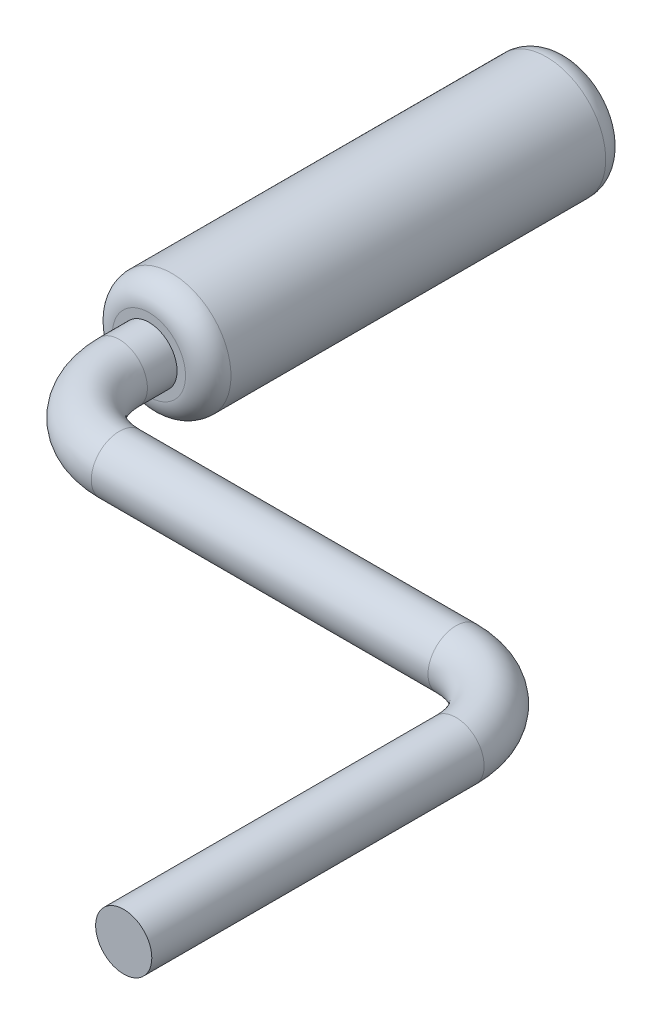
ISO-10303-21;
HEADER;
FILE_DESCRIPTION(('STEP AP214'),'2;1');
FILE_NAME('part.step','',(''),(''),'','','');
FILE_SCHEMA(('AUTOMOTIVE_DESIGN { 1 0 10303 214 1 1 1 1 }'));
ENDSEC;
DATA;
#1=APPLICATION_CONTEXT('core data for automotive mechanical design processes');
#2=APPLICATION_PROTOCOL_DEFINITION('international standard','automotive_design',2000,#1);
#3=PRODUCT_CONTEXT('',#1,'mechanical');
#4=PRODUCT('Part','Part','',(#3));
#5=PRODUCT_RELATED_PRODUCT_CATEGORY('part','',(#4));
#6=PRODUCT_DEFINITION_FORMATION('','',#4);
#7=PRODUCT_DEFINITION_CONTEXT('part definition',#1,'design');
#8=PRODUCT_DEFINITION('design','',#6,#7);
#9=PRODUCT_DEFINITION_SHAPE('','',#8);
#10=(LENGTH_UNIT() NAMED_UNIT(*) SI_UNIT(.MILLI.,.METRE.));
#11=(NAMED_UNIT(*) PLANE_ANGLE_UNIT() SI_UNIT($,.RADIAN.));
#12=(NAMED_UNIT(*) SI_UNIT($,.STERADIAN.) SOLID_ANGLE_UNIT());
#13=UNCERTAINTY_MEASURE_WITH_UNIT(LENGTH_MEASURE(1.E-05),#10,'distance_accuracy_value','');
#14=(GEOMETRIC_REPRESENTATION_CONTEXT(3) GLOBAL_UNCERTAINTY_ASSIGNED_CONTEXT((#13)) GLOBAL_UNIT_ASSIGNED_CONTEXT((#10,
#11,#12)) REPRESENTATION_CONTEXT('',''));
#15=CARTESIAN_POINT('',(0.,0.,0.));
#16=DIRECTION('',(0.,0.,1.));
#17=DIRECTION('',(1.,0.,0.));
#18=AXIS2_PLACEMENT_3D('',#15,#16,#17);
#19=CARTESIAN_POINT('',(-212.73897429128,710.985218525533,-896.762210018078));
#20=DIRECTION('',(0.,0.,-1.));
#21=DIRECTION('',(-1.,0.,0.));
#22=AXIS2_PLACEMENT_3D('',#19,#20,#21);
#23=CYLINDRICAL_SURFACE('',#22,6.28165067377778);
#24=CARTESIAN_POINT('',(-212.73897429128,710.985218525533,-896.762210018078));
#25=DIRECTION('',(0.,0.,-1.));
#26=DIRECTION('',(-1.,0.,0.));
#27=AXIS2_PLACEMENT_3D('',#24,#25,#26);
#28=CIRCLE('',#27,6.28165067377778);
#29=CARTESIAN_POINT('',(-219.020624965058,710.985218525533,-896.762210018078));
#30=VERTEX_POINT('',#29);
#31=EDGE_CURVE('E57',#30,#30,#28,.T.);
#32=ORIENTED_EDGE('',*,*,#31,.T.);
#33=EDGE_LOOP('',(#32));
#34=FACE_BOUND('',#33,.T.);
#35=CARTESIAN_POINT('',(-212.73897429128,710.985218525533,-903.396214376402));
#36=DIRECTION('',(0.,0.,-1.));
#37=DIRECTION('',(-1.,0.,0.));
#38=AXIS2_PLACEMENT_3D('',#35,#36,#37);
#39=CIRCLE('',#38,6.28165067377778);
#40=CARTESIAN_POINT('',(-219.020624965058,710.985218525533,-903.396214376402));
#41=VERTEX_POINT('',#40);
#42=EDGE_CURVE('E54',#41,#41,#39,.F.);
#43=ORIENTED_EDGE('',*,*,#42,.T.);
#44=EDGE_LOOP('',(#43));
#45=FACE_BOUND('',#44,.T.);
#46=ADVANCED_FACE('F33',(#34,#45),#23,.T.);
#47=CARTESIAN_POINT('',(-101.863707381302,710.985218525533,-861.202210018078));
#48=DIRECTION('',(0.,0.,1.));
#49=DIRECTION('',(1.,0.,0.));
#50=AXIS2_PLACEMENT_3D('',#47,#48,#49);
#51=CYLINDRICAL_SURFACE('',#50,6.28165067377778);
#52=CARTESIAN_POINT('',(-101.863707381302,710.985218525533,-861.202210018078));
#53=DIRECTION('',(0.,0.,-1.));
#54=DIRECTION('',(-1.,0.,0.));
#55=AXIS2_PLACEMENT_3D('',#52,#53,#54);
#56=CIRCLE('',#55,6.28165067377778);
#57=CARTESIAN_POINT('',(-95.5820567075241,710.985218525533,-861.202210018078));
#58=VERTEX_POINT('',#57);
#59=EDGE_CURVE('E60',#58,#58,#56,.T.);
#60=CARTESIAN_POINT('',(-101.863707381302,710.985218525533,-786.864459981202));
#61=DIRECTION('',(0.,0.,-1.));
#62=DIRECTION('',(-1.,0.,0.));
#63=AXIS2_PLACEMENT_3D('',#60,#61,#62);
#64=CIRCLE('',#63,6.28165067377778);
#65=CARTESIAN_POINT('',(-95.5820567075241,710.985218525533,-786.864459981202));
#66=VERTEX_POINT('',#65);
#67=EDGE_CURVE('E53',#66,#66,#64,.T.);
#68=CARTESIAN_POINT('',(-95.5820567075241,710.985218525533,-861.202210018078));
#69=CARTESIAN_POINT('',(-95.5820567075241,710.985218525533,-860.427858455194));
#70=CARTESIAN_POINT('',(-95.5820567075241,710.985218525533,-859.65350689231));
#71=CARTESIAN_POINT('',(-95.5820567075241,710.985218525533,-858.104803766541));
#72=CARTESIAN_POINT('',(-95.5820567075241,710.985218525533,-857.330452203657));
#73=CARTESIAN_POINT('',(-95.5820567075241,710.985218525533,-855.781749077889));
#74=CARTESIAN_POINT('',(-95.5820567075241,710.985218525533,-855.007397515005));
#75=CARTESIAN_POINT('',(-95.5820567075241,710.985218525533,-853.458694389236));
#76=CARTESIAN_POINT('',(-95.5820567075241,710.985218525533,-852.684342826352));
#77=CARTESIAN_POINT('',(-95.5820567075241,710.985218525533,-851.135639700584));
#78=CARTESIAN_POINT('',(-95.5820567075241,710.985218525533,-850.3612881377));
#79=CARTESIAN_POINT('',(-95.5820567075241,710.985218525533,-848.812585011932));
#80=CARTESIAN_POINT('',(-95.5820567075241,710.985218525533,-848.038233449048));
#81=CARTESIAN_POINT('',(-95.5820567075241,710.985218525533,-846.489530323279));
#82=CARTESIAN_POINT('',(-95.5820567075241,710.985218525533,-845.715178760395));
#83=CARTESIAN_POINT('',(-95.5820567075241,710.985218525533,-844.166475634627));
#84=CARTESIAN_POINT('',(-95.5820567075241,710.985218525533,-843.392124071743));
#85=CARTESIAN_POINT('',(-95.5820567075241,710.985218525533,-841.843420945975));
#86=CARTESIAN_POINT('',(-95.5820567075241,710.985218525533,-841.06906938309));
#87=CARTESIAN_POINT('',(-95.5820567075241,710.985218525533,-839.520366257322));
#88=CARTESIAN_POINT('',(-95.5820567075241,710.985218525533,-838.746014694438));
#89=CARTESIAN_POINT('',(-95.5820567075241,710.985218525533,-837.19731156867));
#90=CARTESIAN_POINT('',(-95.5820567075241,710.985218525533,-836.422960005786));
#91=CARTESIAN_POINT('',(-95.5820567075241,710.985218525533,-834.874256880017));
#92=CARTESIAN_POINT('',(-95.5820567075241,710.985218525533,-834.099905317133));
#93=CARTESIAN_POINT('',(-95.5820567075241,710.985218525533,-832.551202191365));
#94=CARTESIAN_POINT('',(-95.5820567075241,710.985218525533,-831.776850628481));
#95=CARTESIAN_POINT('',(-95.5820567075241,710.985218525533,-830.228147502713));
#96=CARTESIAN_POINT('',(-95.5820567075241,710.985218525533,-829.453795939829));
#97=CARTESIAN_POINT('',(-95.5820567075241,710.985218525533,-827.90509281406));
#98=CARTESIAN_POINT('',(-95.5820567075241,710.985218525533,-827.130741251176));
#99=CARTESIAN_POINT('',(-95.5820567075241,710.985218525533,-825.582038125408));
#100=CARTESIAN_POINT('',(-95.5820567075241,710.985218525533,-824.807686562524));
#101=CARTESIAN_POINT('',(-95.5820567075241,710.985218525533,-823.258983436756));
#102=CARTESIAN_POINT('',(-95.5820567075241,710.985218525533,-822.484631873871));
#103=CARTESIAN_POINT('',(-95.5820567075241,710.985218525533,-820.935928748103));
#104=CARTESIAN_POINT('',(-95.5820567075241,710.985218525533,-820.161577185219));
#105=CARTESIAN_POINT('',(-95.5820567075241,710.985218525533,-818.612874059451));
#106=CARTESIAN_POINT('',(-95.5820567075241,710.985218525533,-817.838522496567));
#107=CARTESIAN_POINT('',(-95.5820567075241,710.985218525533,-816.289819370798));
#108=CARTESIAN_POINT('',(-95.5820567075241,710.985218525533,-815.515467807914));
#109=CARTESIAN_POINT('',(-95.5820567075241,710.985218525533,-813.966764682146));
#110=CARTESIAN_POINT('',(-95.5820567075241,710.985218525533,-813.192413119262));
#111=CARTESIAN_POINT('',(-95.5820567075241,710.985218525533,-811.643709993494));
#112=CARTESIAN_POINT('',(-95.5820567075241,710.985218525533,-810.86935843061));
#113=CARTESIAN_POINT('',(-95.5820567075241,710.985218525533,-809.320655304841));
#114=CARTESIAN_POINT('',(-95.5820567075241,710.985218525533,-808.546303741957));
#115=CARTESIAN_POINT('',(-95.5820567075241,710.985218525533,-806.997600616189));
#116=CARTESIAN_POINT('',(-95.5820567075241,710.985218525533,-806.223249053305));
#117=CARTESIAN_POINT('',(-95.5820567075241,710.985218525533,-804.674545927537));
#118=CARTESIAN_POINT('',(-95.5820567075241,710.985218525533,-803.900194364652));
#119=CARTESIAN_POINT('',(-95.5820567075241,710.985218525533,-802.351491238884));
#120=CARTESIAN_POINT('',(-95.5820567075241,710.985218525533,-801.577139676));
#121=CARTESIAN_POINT('',(-95.5820567075241,710.985218525533,-800.028436550232));
#122=CARTESIAN_POINT('',(-95.5820567075241,710.985218525533,-799.254084987348));
#123=CARTESIAN_POINT('',(-95.5820567075241,710.985218525533,-797.705381861579));
#124=CARTESIAN_POINT('',(-95.5820567075241,710.985218525533,-796.931030298695));
#125=CARTESIAN_POINT('',(-95.5820567075241,710.985218525533,-795.382327172927));
#126=CARTESIAN_POINT('',(-95.5820567075241,710.985218525533,-794.607975610043));
#127=CARTESIAN_POINT('',(-95.5820567075241,710.985218525533,-793.059272484275));
#128=CARTESIAN_POINT('',(-95.5820567075241,710.985218525533,-792.284920921391));
#129=CARTESIAN_POINT('',(-95.5820567075241,710.985218525533,-790.736217795622));
#130=CARTESIAN_POINT('',(-95.5820567075241,710.985218525533,-789.961866232738));
#131=CARTESIAN_POINT('',(-95.5820567075241,710.985218525533,-788.41316310697));
#132=CARTESIAN_POINT('',(-95.5820567075241,710.985218525533,-787.638811544086));
#133=CARTESIAN_POINT('',(-95.5820567075241,710.985218525533,-786.864459981202));
#134=B_SPLINE_CURVE_WITH_KNOTS('',3,(#68,#69,#70,#71,#72,#73,#74,#75,#76,#77,#78,#79,#80,#81,
#82,#83,#84,#85,#86,#87,#88,#89,#90,#91,#92,#93,#94,#95,#96,#97,#98,#99,#100,#101,#102,#103,
#104,#105,#106,#107,#108,#109,#110,#111,#112,#113,#114,#115,#116,#117,#118,#119,#120,#121,#122,
#123,#124,#125,#126,#127,#128,#129,#130,#131,#132,#133),.UNSPECIFIED.,.F.,.F.,(4,2,2,2,2,2,2,2,
2,2,2,2,2,2,2,2,2,2,2,2,2,2,2,2,2,2,2,2,2,2,2,2,4),(0.,2.32305468865246,4.64610937730481,
6.96916406595716,9.29221875460962,11.615273443262,13.9383281319143,16.2613828205667,
18.5844375092191,20.9074921978715,23.2305468865238,25.5536015751762,27.8766562638286,
30.199710952481,32.5227656411333,34.8458203297857,37.1688750184381,39.4919297070905,
41.8149843957428,44.1380390843952,46.4610937730476,48.7841484617,51.1072031503523,
53.4302578390047,55.7533125276571,58.0763672163095,60.3994219049618,62.7224765936142,
65.0455312822666,67.368585970919,69.6916406595713,72.0146953482237,74.3377500368761),.UNSPECIFIED.);
#135=EDGE_CURVE('BSEAM90',#58,#66,#134,.T.);
#136=ORIENTED_EDGE('',*,*,#59,.F.);
#137=ORIENTED_EDGE('',*,*,#67,.T.);
#138=ORIENTED_EDGE('',*,*,#135,.T.);
#139=ORIENTED_EDGE('',*,*,#135,.F.);
#140=EDGE_LOOP('',(#136,#138,#137,#139));
#141=FACE_BOUND('',#140,.T.);
#142=ADVANCED_FACE('F90',(#141),#51,.T.);
#143=CARTESIAN_POINT('',(-119.643707381302,710.985218525533,-861.202210018078));
#144=DIRECTION('',(0.,-1.,0.));
#145=DIRECTION('',(0.,0.,-1.));
#146=AXIS2_PLACEMENT_3D('',#143,#144,#145);
#147=TOROIDAL_SURFACE('',#146,17.78,6.28165067377778);
#148=CARTESIAN_POINT('',(-119.643707381302,710.985218525533,-878.982210018078));
#149=DIRECTION('',(-1.,0.,0.));
#150=DIRECTION('',(0.,0.,1.));
#151=AXIS2_PLACEMENT_3D('',#148,#149,#150);
#152=CIRCLE('',#151,6.28165067377778);
#153=CARTESIAN_POINT('',(-119.643707381302,710.985218525533,-885.263860691856));
#154=VERTEX_POINT('',#153);
#155=EDGE_CURVE('E63',#154,#154,#152,.T.);
#156=CARTESIAN_POINT('',(-119.643707381302,710.985218525533,-861.202210018078));
#157=DIRECTION('',(0.,-1.,0.));
#158=DIRECTION('',(0.,0.,-1.));
#159=AXIS2_PLACEMENT_3D('',#156,#157,#158);
#160=CIRCLE('',#159,24.0616506737778);
#161=EDGE_CURVE('',#154,#58,#160,.T.);
#162=ORIENTED_EDGE('',*,*,#155,.F.);
#163=ORIENTED_EDGE('',*,*,#59,.T.);
#164=ORIENTED_EDGE('',*,*,#161,.T.);
#165=ORIENTED_EDGE('',*,*,#161,.F.);
#166=EDGE_LOOP('',(#162,#164,#163,#165));
#167=FACE_BOUND('',#166,.T.);
#168=ADVANCED_FACE('F84',(#167),#147,.T.);
#169=CARTESIAN_POINT('',(-194.95897429128,710.985218525533,-878.982210018078));
#170=DIRECTION('',(1.,0.,0.));
#171=DIRECTION('',(0.,0.,-1.));
#172=AXIS2_PLACEMENT_3D('',#169,#170,#171);
#173=CYLINDRICAL_SURFACE('',#172,6.28165067377778);
#174=CARTESIAN_POINT('',(-194.95897429128,710.985218525533,-878.982210018078));
#175=DIRECTION('',(-1.,0.,0.));
#176=DIRECTION('',(0.,0.,1.));
#177=AXIS2_PLACEMENT_3D('',#174,#175,#176);
#178=CIRCLE('',#177,6.28165067377778);
#179=CARTESIAN_POINT('',(-194.95897429128,710.985218525533,-872.7005593443));
#180=VERTEX_POINT('',#179);
#181=EDGE_CURVE('E66',#180,#180,#178,.T.);
#182=ORIENTED_EDGE('',*,*,#181,.F.);
#183=EDGE_LOOP('',(#182));
#184=FACE_BOUND('',#183,.T.);
#185=ORIENTED_EDGE('',*,*,#155,.T.);
#186=EDGE_LOOP('',(#185));
#187=FACE_BOUND('',#186,.T.);
#188=ADVANCED_FACE('F78',(#184,#187),#173,.T.);
#189=CARTESIAN_POINT('',(-194.95897429128,710.985218525533,-896.762210018078));
#190=DIRECTION('',(0.,1.,0.));
#191=DIRECTION('',(0.,0.,1.));
#192=AXIS2_PLACEMENT_3D('',#189,#190,#191);
#193=TOROIDAL_SURFACE('',#192,17.78,6.28165067377778);
#194=CARTESIAN_POINT('',(-194.95897429128,710.985218525533,-896.762210018078));
#195=DIRECTION('',(0.,1.,0.));
#196=DIRECTION('',(0.,0.,1.));
#197=AXIS2_PLACEMENT_3D('',#194,#195,#196);
#198=CIRCLE('',#197,24.0616506737778);
#199=EDGE_CURVE('',#30,#180,#198,.T.);
#200=ORIENTED_EDGE('',*,*,#31,.F.);
#201=ORIENTED_EDGE('',*,*,#181,.T.);
#202=ORIENTED_EDGE('',*,*,#199,.T.);
#203=ORIENTED_EDGE('',*,*,#199,.F.);
#204=EDGE_LOOP('',(#200,#202,#201,#203));
#205=FACE_BOUND('',#204,.T.);
#206=ADVANCED_FACE('F74',(#205),#193,.T.);
#207=CARTESIAN_POINT('',(-101.863707381302,710.985218525533,-786.864459981202));
#208=DIRECTION('',(0.,0.,-1.));
#209=DIRECTION('',(-1.,0.,0.));
#210=AXIS2_PLACEMENT_3D('',#207,#208,#209);
#211=PLANE('',#210);
#212=ORIENTED_EDGE('',*,*,#67,.F.);
#213=EDGE_LOOP('',(#212));
#214=FACE_BOUND('',#213,.T.);
#215=ADVANCED_FACE('F77',(#214),#211,.F.);
#216=CARTESIAN_POINT('',(-212.73897429128,710.985218525533,-903.396214376402));
#217=DIRECTION('',(0.,0.,-1.));
#218=DIRECTION('',(-1.,0.,0.));
#219=AXIS2_PLACEMENT_3D('',#216,#217,#218);
#220=CYLINDRICAL_SURFACE('',#219,13.2569706472445);
#221=CARTESIAN_POINT('',(-212.73897429128,710.985218525533,-992.296214376402));
#222=DIRECTION('',(0.,0.,-1.));
#223=DIRECTION('',(-1.,0.,0.));
#224=AXIS2_PLACEMENT_3D('',#221,#222,#223);
#225=CIRCLE('',#224,13.2569706472445);
#226=CARTESIAN_POINT('',(-225.995944938524,710.985218525533,-992.296214376402));
#227=VERTEX_POINT('',#226);
#228=EDGE_CURVE('E40',#227,#227,#225,.F.);
#229=CARTESIAN_POINT('',(-212.73897429128,710.985218525533,-908.476214376402));
#230=DIRECTION('',(0.,0.,-1.));
#231=DIRECTION('',(-1.,0.,0.));
#232=AXIS2_PLACEMENT_3D('',#229,#230,#231);
#233=CIRCLE('',#232,13.2569706472445);
#234=CARTESIAN_POINT('',(-225.995944938524,710.985218525533,-908.476214376402));
#235=VERTEX_POINT('',#234);
#236=EDGE_CURVE('E44',#235,#235,#233,.T.);
#237=CARTESIAN_POINT('',(-225.995944938524,710.985218525533,-992.296214376402));
#238=CARTESIAN_POINT('',(-225.995944938524,710.985218525533,-991.423089376402));
#239=CARTESIAN_POINT('',(-225.995944938524,710.985218525533,-990.549964376402));
#240=CARTESIAN_POINT('',(-225.995944938524,710.985218525533,-988.803714376402));
#241=CARTESIAN_POINT('',(-225.995944938524,710.985218525533,-987.930589376402));
#242=CARTESIAN_POINT('',(-225.995944938524,710.985218525533,-986.184339376402));
#243=CARTESIAN_POINT('',(-225.995944938524,710.985218525533,-985.311214376402));
#244=CARTESIAN_POINT('',(-225.995944938524,710.985218525533,-983.564964376402));
#245=CARTESIAN_POINT('',(-225.995944938524,710.985218525533,-982.691839376402));
#246=CARTESIAN_POINT('',(-225.995944938524,710.985218525533,-980.945589376402));
#247=CARTESIAN_POINT('',(-225.995944938524,710.985218525533,-980.072464376402));
#248=CARTESIAN_POINT('',(-225.995944938524,710.985218525533,-978.326214376402));
#249=CARTESIAN_POINT('',(-225.995944938524,710.985218525533,-977.453089376402));
#250=CARTESIAN_POINT('',(-225.995944938524,710.985218525533,-975.706839376402));
#251=CARTESIAN_POINT('',(-225.995944938524,710.985218525533,-974.833714376402));
#252=CARTESIAN_POINT('',(-225.995944938524,710.985218525533,-973.087464376402));
#253=CARTESIAN_POINT('',(-225.995944938524,710.985218525533,-972.214339376402));
#254=CARTESIAN_POINT('',(-225.995944938524,710.985218525533,-970.468089376402));
#255=CARTESIAN_POINT('',(-225.995944938524,710.985218525533,-969.594964376402));
#256=CARTESIAN_POINT('',(-225.995944938524,710.985218525533,-967.848714376402));
#257=CARTESIAN_POINT('',(-225.995944938524,710.985218525533,-966.975589376402));
#258=CARTESIAN_POINT('',(-225.995944938524,710.985218525533,-965.229339376402));
#259=CARTESIAN_POINT('',(-225.995944938524,710.985218525533,-964.356214376402));
#260=CARTESIAN_POINT('',(-225.995944938524,710.985218525533,-962.609964376402));
#261=CARTESIAN_POINT('',(-225.995944938524,710.985218525533,-961.736839376402));
#262=CARTESIAN_POINT('',(-225.995944938524,710.985218525533,-959.990589376402));
#263=CARTESIAN_POINT('',(-225.995944938524,710.985218525533,-959.117464376402));
#264=CARTESIAN_POINT('',(-225.995944938524,710.985218525533,-957.371214376402));
#265=CARTESIAN_POINT('',(-225.995944938524,710.985218525533,-956.498089376402));
#266=CARTESIAN_POINT('',(-225.995944938524,710.985218525533,-954.751839376402));
#267=CARTESIAN_POINT('',(-225.995944938524,710.985218525533,-953.878714376402));
#268=CARTESIAN_POINT('',(-225.995944938524,710.985218525533,-952.132464376402));
#269=CARTESIAN_POINT('',(-225.995944938524,710.985218525533,-951.259339376402));
#270=CARTESIAN_POINT('',(-225.995944938524,710.985218525533,-949.513089376402));
#271=CARTESIAN_POINT('',(-225.995944938524,710.985218525533,-948.639964376402));
#272=CARTESIAN_POINT('',(-225.995944938524,710.985218525533,-946.893714376402));
#273=CARTESIAN_POINT('',(-225.995944938524,710.985218525533,-946.020589376402));
#274=CARTESIAN_POINT('',(-225.995944938524,710.985218525533,-944.274339376402));
#275=CARTESIAN_POINT('',(-225.995944938524,710.985218525533,-943.401214376402));
#276=CARTESIAN_POINT('',(-225.995944938524,710.985218525533,-941.654964376402));
#277=CARTESIAN_POINT('',(-225.995944938524,710.985218525533,-940.781839376402));
#278=CARTESIAN_POINT('',(-225.995944938524,710.985218525533,-939.035589376402));
#279=CARTESIAN_POINT('',(-225.995944938524,710.985218525533,-938.162464376402));
#280=CARTESIAN_POINT('',(-225.995944938524,710.985218525533,-936.416214376402));
#281=CARTESIAN_POINT('',(-225.995944938524,710.985218525533,-935.543089376402));
#282=CARTESIAN_POINT('',(-225.995944938524,710.985218525533,-933.796839376402));
#283=CARTESIAN_POINT('',(-225.995944938524,710.985218525533,-932.923714376402));
#284=CARTESIAN_POINT('',(-225.995944938524,710.985218525533,-931.177464376402));
#285=CARTESIAN_POINT('',(-225.995944938524,710.985218525533,-930.304339376402));
#286=CARTESIAN_POINT('',(-225.995944938524,710.985218525533,-928.558089376402));
#287=CARTESIAN_POINT('',(-225.995944938524,710.985218525533,-927.684964376402));
#288=CARTESIAN_POINT('',(-225.995944938524,710.985218525533,-925.938714376402));
#289=CARTESIAN_POINT('',(-225.995944938524,710.985218525533,-925.065589376402));
#290=CARTESIAN_POINT('',(-225.995944938524,710.985218525533,-923.319339376402));
#291=CARTESIAN_POINT('',(-225.995944938524,710.985218525533,-922.446214376402));
#292=CARTESIAN_POINT('',(-225.995944938524,710.985218525533,-920.699964376402));
#293=CARTESIAN_POINT('',(-225.995944938524,710.985218525533,-919.826839376402));
#294=CARTESIAN_POINT('',(-225.995944938524,710.985218525533,-918.080589376402));
#295=CARTESIAN_POINT('',(-225.995944938524,710.985218525533,-917.207464376402));
#296=CARTESIAN_POINT('',(-225.995944938524,710.985218525533,-915.461214376402));
#297=CARTESIAN_POINT('',(-225.995944938524,710.985218525533,-914.588089376402));
#298=CARTESIAN_POINT('',(-225.995944938524,710.985218525533,-912.841839376402));
#299=CARTESIAN_POINT('',(-225.995944938524,710.985218525533,-911.968714376402));
#300=CARTESIAN_POINT('',(-225.995944938524,710.985218525533,-910.222464376402));
#301=CARTESIAN_POINT('',(-225.995944938524,710.985218525533,-909.349339376402));
#302=CARTESIAN_POINT('',(-225.995944938524,710.985218525533,-908.476214376402));
#303=B_SPLINE_CURVE_WITH_KNOTS('',3,(#237,#238,#239,#240,#241,#242,#243,#244,#245,#246,#247,
#248,#249,#250,#251,#252,#253,#254,#255,#256,#257,#258,#259,#260,#261,#262,#263,#264,#265,#266,
#267,#268,#269,#270,#271,#272,#273,#274,#275,#276,#277,#278,#279,#280,#281,#282,#283,#284,#285,
#286,#287,#288,#289,#290,#291,#292,#293,#294,#295,#296,#297,#298,#299,#300,#301,#302),
.UNSPECIFIED.,.F.,.F.,(4,2,2,2,2,2,2,2,2,2,2,2,2,2,2,2,2,2,2,2,2,2,2,2,2,2,2,2,2,2,2,2,4),(0.,
2.61937499999998,5.23874999999996,7.85812499999994,10.4774999999999,13.096875,15.71625,
18.335625,20.9549999999999,23.5743749999999,26.1937499999999,28.813125,31.4325,34.051875,
36.6712499999999,39.2906249999999,41.91,44.529375,47.14875,49.7681249999999,52.3874999999999,
55.006875,57.62625,60.245625,62.865,65.4843749999999,68.1037499999999,70.723125,73.3425,
75.961875,78.5812499999999,81.2006249999999,83.82),.UNSPECIFIED.);
#304=EDGE_CURVE('BSEAM100',#227,#235,#303,.T.);
#305=ORIENTED_EDGE('',*,*,#228,.T.);
#306=ORIENTED_EDGE('',*,*,#236,.T.);
#307=ORIENTED_EDGE('',*,*,#304,.T.);
#308=ORIENTED_EDGE('',*,*,#304,.F.);
#309=EDGE_LOOP('',(#305,#307,#306,#308));
#310=FACE_BOUND('',#309,.T.);
#311=ADVANCED_FACE('F100',(#310),#220,.T.);
#312=CARTESIAN_POINT('',(-212.73897429128,710.985218525533,-903.396214376402));
#313=DIRECTION('',(0.,0.,-1.));
#314=DIRECTION('',(-1.,0.,0.));
#315=AXIS2_PLACEMENT_3D('',#312,#313,#314);
#316=PLANE('',#315);
#317=CARTESIAN_POINT('',(-212.73897429128,710.985218525533,-903.396214376402));
#318=DIRECTION('',(0.,0.,-1.));
#319=DIRECTION('',(-1.,0.,0.));
#320=AXIS2_PLACEMENT_3D('',#317,#318,#319);
#321=CIRCLE('',#320,8.1769706472445);
#322=CARTESIAN_POINT('',(-220.915944938524,710.985218525533,-903.396214376402));
#323=VERTEX_POINT('',#322);
#324=EDGE_CURVE('E10',#323,#323,#321,.F.);
#325=ORIENTED_EDGE('',*,*,#324,.T.);
#326=EDGE_LOOP('',(#325));
#327=FACE_BOUND('',#326,.T.);
#328=ORIENTED_EDGE('',*,*,#42,.F.);
#329=EDGE_LOOP('',(#328));
#330=FACE_BOUND('',#329,.T.);
#331=ADVANCED_FACE('F105',(#327,#330),#316,.F.);
#332=CARTESIAN_POINT('',(-212.73897429128,710.985218525533,-997.376214376402));
#333=DIRECTION('',(0.,0.,-1.));
#334=DIRECTION('',(-1.,0.,0.));
#335=AXIS2_PLACEMENT_3D('',#332,#333,#334);
#336=PLANE('',#335);
#337=CARTESIAN_POINT('',(-212.73897429128,710.985218525533,-997.376214376402));
#338=DIRECTION('',(0.,0.,-1.));
#339=DIRECTION('',(-1.,0.,0.));
#340=AXIS2_PLACEMENT_3D('',#337,#338,#339);
#341=CIRCLE('',#340,8.1769706472445);
#342=CARTESIAN_POINT('',(-220.915944938524,710.985218525533,-997.376214376402));
#343=VERTEX_POINT('',#342);
#344=EDGE_CURVE('E48',#343,#343,#341,.T.);
#345=ORIENTED_EDGE('',*,*,#344,.T.);
#346=EDGE_LOOP('',(#345));
#347=FACE_BOUND('',#346,.T.);
#348=ADVANCED_FACE('F112',(#347),#336,.T.);
#349=CARTESIAN_POINT('',(-212.73897429128,710.985218525533,-992.296214376402));
#350=DIRECTION('',(0.,0.,-1.));
#351=DIRECTION('',(-1.,0.,0.));
#352=AXIS2_PLACEMENT_3D('',#349,#350,#351);
#353=TOROIDAL_SURFACE('',#352,8.1769706472445,5.08);
#354=ORIENTED_EDGE('',*,*,#228,.F.);
#355=EDGE_LOOP('',(#354));
#356=FACE_BOUND('',#355,.T.);
#357=ORIENTED_EDGE('',*,*,#344,.F.);
#358=EDGE_LOOP('',(#357));
#359=FACE_BOUND('',#358,.T.);
#360=ADVANCED_FACE('F113',(#356,#359),#353,.T.);
#361=CARTESIAN_POINT('',(-212.73897429128,710.985218525533,-908.476214376402));
#362=DIRECTION('',(0.,0.,-1.));
#363=DIRECTION('',(-1.,0.,0.));
#364=AXIS2_PLACEMENT_3D('',#361,#362,#363);
#365=TOROIDAL_SURFACE('',#364,8.1769706472445,5.08);
#366=ORIENTED_EDGE('',*,*,#324,.F.);
#367=EDGE_LOOP('',(#366));
#368=FACE_BOUND('',#367,.T.);
#369=ORIENTED_EDGE('',*,*,#236,.F.);
#370=EDGE_LOOP('',(#369));
#371=FACE_BOUND('',#370,.T.);
#372=ADVANCED_FACE('F35',(#368,#371),#365,.T.);
#373=CLOSED_SHELL('',(#46,#142,#168,#188,#206,#215,#311,#331,#348,#360,#372));
#374=MANIFOLD_SOLID_BREP('B2',#373);
#375=ADVANCED_BREP_SHAPE_REPRESENTATION('',(#18,#374),#14);
#376=SHAPE_DEFINITION_REPRESENTATION(#9,#375);
ENDSEC;
END-ISO-10303-21;
